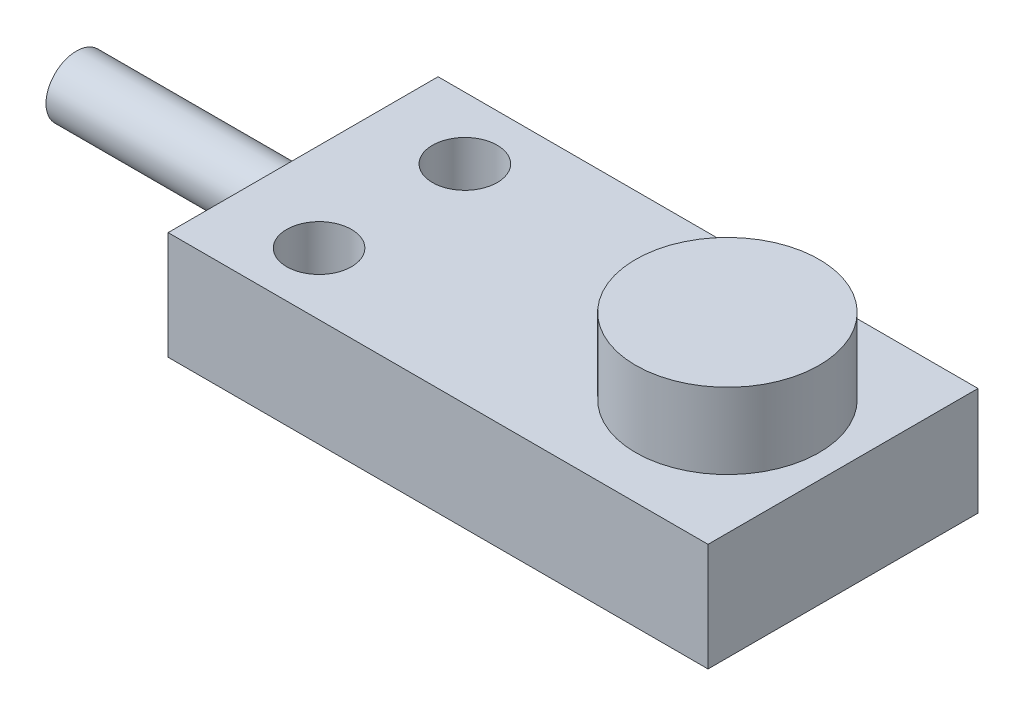
ISO-10303-21;
HEADER;
FILE_DESCRIPTION(('STEP AP214'),'2;1');
FILE_NAME('part.step','',(''),(''),'','','');
FILE_SCHEMA(('AUTOMOTIVE_DESIGN { 1 0 10303 214 1 1 1 1 }'));
ENDSEC;
DATA;
#1=APPLICATION_CONTEXT('core data for automotive mechanical design processes');
#2=APPLICATION_PROTOCOL_DEFINITION('international standard','automotive_design',2000,#1);
#3=PRODUCT_CONTEXT('',#1,'mechanical');
#4=PRODUCT('Part','Part','',(#3));
#5=PRODUCT_RELATED_PRODUCT_CATEGORY('part','',(#4));
#6=PRODUCT_DEFINITION_FORMATION('','',#4);
#7=PRODUCT_DEFINITION_CONTEXT('part definition',#1,'design');
#8=PRODUCT_DEFINITION('design','',#6,#7);
#9=PRODUCT_DEFINITION_SHAPE('','',#8);
#10=(LENGTH_UNIT() NAMED_UNIT(*) SI_UNIT(.MILLI.,.METRE.));
#11=(NAMED_UNIT(*) PLANE_ANGLE_UNIT() SI_UNIT($,.RADIAN.));
#12=(NAMED_UNIT(*) SI_UNIT($,.STERADIAN.) SOLID_ANGLE_UNIT());
#13=UNCERTAINTY_MEASURE_WITH_UNIT(LENGTH_MEASURE(1.E-05),#10,'distance_accuracy_value','');
#14=(GEOMETRIC_REPRESENTATION_CONTEXT(3) GLOBAL_UNCERTAINTY_ASSIGNED_CONTEXT((#13)) GLOBAL_UNIT_ASSIGNED_CONTEXT((#10,
#11,#12)) REPRESENTATION_CONTEXT('',''));
#15=CARTESIAN_POINT('',(0.,0.,0.));
#16=DIRECTION('',(0.,0.,1.));
#17=DIRECTION('',(1.,0.,0.));
#18=AXIS2_PLACEMENT_3D('',#15,#16,#17);
#19=CARTESIAN_POINT('',(25.,10.,0.));
#20=DIRECTION('',(1.,0.,0.));
#21=DIRECTION('',(0.,0.,-1.));
#22=AXIS2_PLACEMENT_3D('',#19,#20,#21);
#23=PLANE('',#22);
#24=DIRECTION('',(0.,0.,1.));
#25=VECTOR('',#24,1.);
#26=CARTESIAN_POINT('',(25.,0.,0.));
#27=LINE('',#26,#25);
#28=CARTESIAN_POINT('',(25.,0.,-12.5));
#29=VERTEX_POINT('',#28);
#30=CARTESIAN_POINT('',(25.,0.,12.5));
#31=VERTEX_POINT('',#30);
#32=EDGE_CURVE('E113',#29,#31,#27,.T.);
#33=ORIENTED_EDGE('',*,*,#32,.F.);
#34=DIRECTION('',(0.,-1.,0.));
#35=VECTOR('',#34,1.);
#36=CARTESIAN_POINT('',(25.,10.,-12.5));
#37=LINE('',#36,#35);
#38=CARTESIAN_POINT('',(25.,10.,-12.5));
#39=VERTEX_POINT('',#38);
#40=EDGE_CURVE('E43',#39,#29,#37,.T.);
#41=ORIENTED_EDGE('',*,*,#40,.F.);
#42=DIRECTION('',(0.,0.,1.));
#43=VECTOR('',#42,1.);
#44=CARTESIAN_POINT('',(25.,10.,0.));
#45=LINE('',#44,#43);
#46=CARTESIAN_POINT('',(25.,10.,12.5));
#47=VERTEX_POINT('',#46);
#48=EDGE_CURVE('E101',#39,#47,#45,.T.);
#49=ORIENTED_EDGE('',*,*,#48,.T.);
#50=DIRECTION('',(0.,-1.,0.));
#51=VECTOR('',#50,1.);
#52=CARTESIAN_POINT('',(25.,10.,12.5));
#53=LINE('',#52,#51);
#54=EDGE_CURVE('E80',#47,#31,#53,.T.);
#55=ORIENTED_EDGE('',*,*,#54,.T.);
#56=EDGE_LOOP('',(#33,#41,#49,#55));
#57=FACE_BOUND('',#56,.T.);
#58=ADVANCED_FACE('F40',(#57),#23,.T.);
#59=CARTESIAN_POINT('',(0.,10.,-12.5));
#60=DIRECTION('',(0.,0.,-1.));
#61=DIRECTION('',(-1.,0.,0.));
#62=AXIS2_PLACEMENT_3D('',#59,#60,#61);
#63=PLANE('',#62);
#64=DIRECTION('',(1.,0.,0.));
#65=VECTOR('',#64,1.);
#66=CARTESIAN_POINT('',(0.,0.,-12.5));
#67=LINE('',#66,#65);
#68=CARTESIAN_POINT('',(-25.,0.,-12.5));
#69=VERTEX_POINT('',#68);
#70=EDGE_CURVE('E94',#69,#29,#67,.T.);
#71=ORIENTED_EDGE('',*,*,#70,.F.);
#72=DIRECTION('',(0.,-1.,0.));
#73=VECTOR('',#72,1.);
#74=CARTESIAN_POINT('',(-25.,10.,-12.5));
#75=LINE('',#74,#73);
#76=CARTESIAN_POINT('',(-25.,10.,-12.5));
#77=VERTEX_POINT('',#76);
#78=EDGE_CURVE('E88',#77,#69,#75,.T.);
#79=ORIENTED_EDGE('',*,*,#78,.F.);
#80=DIRECTION('',(1.,0.,0.));
#81=VECTOR('',#80,1.);
#82=CARTESIAN_POINT('',(0.,10.,-12.5));
#83=LINE('',#82,#81);
#84=EDGE_CURVE('E92',#77,#39,#83,.T.);
#85=ORIENTED_EDGE('',*,*,#84,.T.);
#86=ORIENTED_EDGE('',*,*,#40,.T.);
#87=EDGE_LOOP('',(#71,#79,#85,#86));
#88=FACE_BOUND('',#87,.T.);
#89=ADVANCED_FACE('F90',(#88),#63,.T.);
#90=CARTESIAN_POINT('',(-25.,10.,0.));
#91=DIRECTION('',(1.,0.,0.));
#92=DIRECTION('',(0.,0.,-1.));
#93=AXIS2_PLACEMENT_3D('',#90,#91,#92);
#94=PLANE('',#93);
#95=CARTESIAN_POINT('',(-25.,5.,0.));
#96=DIRECTION('',(-1.,0.,0.));
#97=DIRECTION('',(0.,0.,1.));
#98=AXIS2_PLACEMENT_3D('',#95,#96,#97);
#99=CIRCLE('',#98,2.80875684078272);
#100=CARTESIAN_POINT('',(-25.,5.,2.80875684078272));
#101=VERTEX_POINT('',#100);
#102=EDGE_CURVE('E11',#101,#101,#99,.T.);
#103=ORIENTED_EDGE('',*,*,#102,.F.);
#104=EDGE_LOOP('',(#103));
#105=FACE_BOUND('',#104,.T.);
#106=DIRECTION('',(0.,0.,1.));
#107=VECTOR('',#106,1.);
#108=CARTESIAN_POINT('',(-25.,0.,0.));
#109=LINE('',#108,#107);
#110=CARTESIAN_POINT('',(-25.,0.,12.5));
#111=VERTEX_POINT('',#110);
#112=EDGE_CURVE('E73',#69,#111,#109,.T.);
#113=ORIENTED_EDGE('',*,*,#112,.T.);
#114=DIRECTION('',(0.,-1.,0.));
#115=VECTOR('',#114,1.);
#116=CARTESIAN_POINT('',(-25.,10.,12.5));
#117=LINE('',#116,#115);
#118=CARTESIAN_POINT('',(-25.,10.,12.5));
#119=VERTEX_POINT('',#118);
#120=EDGE_CURVE('E95',#119,#111,#117,.T.);
#121=ORIENTED_EDGE('',*,*,#120,.F.);
#122=DIRECTION('',(0.,0.,1.));
#123=VECTOR('',#122,1.);
#124=CARTESIAN_POINT('',(-25.,10.,0.));
#125=LINE('',#124,#123);
#126=EDGE_CURVE('E96',#77,#119,#125,.T.);
#127=ORIENTED_EDGE('',*,*,#126,.F.);
#128=ORIENTED_EDGE('',*,*,#78,.T.);
#129=EDGE_LOOP('',(#113,#121,#127,#128));
#130=FACE_BOUND('',#129,.T.);
#131=ADVANCED_FACE('F97',(#105,#130),#94,.F.);
#132=CARTESIAN_POINT('',(-16.769801980198,10.,-6.75));
#133=DIRECTION('',(0.,-1.,0.));
#134=DIRECTION('',(0.,0.,-1.));
#135=AXIS2_PLACEMENT_3D('',#132,#133,#134);
#136=CYLINDRICAL_SURFACE('',#135,3.);
#137=CARTESIAN_POINT('',(-16.769801980198,10.,-6.75));
#138=DIRECTION('',(0.,1.,0.));
#139=DIRECTION('',(0.,0.,1.));
#140=AXIS2_PLACEMENT_3D('',#137,#138,#139);
#141=CIRCLE('',#140,3.);
#142=CARTESIAN_POINT('',(-16.769801980198,10.,-3.75));
#143=VERTEX_POINT('',#142);
#144=EDGE_CURVE('E107',#143,#143,#141,.T.);
#145=ORIENTED_EDGE('',*,*,#144,.T.);
#146=EDGE_LOOP('',(#145));
#147=FACE_BOUND('',#146,.T.);
#148=CARTESIAN_POINT('',(-16.769801980198,0.,-6.75));
#149=DIRECTION('',(0.,1.,0.));
#150=DIRECTION('',(0.,0.,1.));
#151=AXIS2_PLACEMENT_3D('',#148,#149,#150);
#152=CIRCLE('',#151,3.);
#153=CARTESIAN_POINT('',(-16.769801980198,0.,-3.75));
#154=VERTEX_POINT('',#153);
#155=EDGE_CURVE('E121',#154,#154,#152,.T.);
#156=ORIENTED_EDGE('',*,*,#155,.F.);
#157=EDGE_LOOP('',(#156));
#158=FACE_BOUND('',#157,.T.);
#159=ADVANCED_FACE('F141',(#147,#158),#136,.F.);
#160=CARTESIAN_POINT('',(0.,10.,12.5));
#161=DIRECTION('',(0.,0.,-1.));
#162=DIRECTION('',(-1.,0.,0.));
#163=AXIS2_PLACEMENT_3D('',#160,#161,#162);
#164=PLANE('',#163);
#165=DIRECTION('',(1.,0.,0.));
#166=VECTOR('',#165,1.);
#167=CARTESIAN_POINT('',(0.,0.,12.5));
#168=LINE('',#167,#166);
#169=EDGE_CURVE('E119',#111,#31,#168,.T.);
#170=ORIENTED_EDGE('',*,*,#169,.T.);
#171=ORIENTED_EDGE('',*,*,#54,.F.);
#172=DIRECTION('',(1.,0.,0.));
#173=VECTOR('',#172,1.);
#174=CARTESIAN_POINT('',(0.,10.,12.5));
#175=LINE('',#174,#173);
#176=EDGE_CURVE('E57',#119,#47,#175,.T.);
#177=ORIENTED_EDGE('',*,*,#176,.F.);
#178=ORIENTED_EDGE('',*,*,#120,.T.);
#179=EDGE_LOOP('',(#170,#171,#177,#178));
#180=FACE_BOUND('',#179,.T.);
#181=ADVANCED_FACE('F129',(#180),#164,.F.);
#182=CARTESIAN_POINT('',(-16.769801980198,10.,6.75));
#183=DIRECTION('',(0.,-1.,0.));
#184=DIRECTION('',(0.,0.,-1.));
#185=AXIS2_PLACEMENT_3D('',#182,#183,#184);
#186=CYLINDRICAL_SURFACE('',#185,3.);
#187=CARTESIAN_POINT('',(-16.769801980198,10.,6.75));
#188=DIRECTION('',(0.,1.,0.));
#189=DIRECTION('',(0.,0.,1.));
#190=AXIS2_PLACEMENT_3D('',#187,#188,#189);
#191=CIRCLE('',#190,3.);
#192=CARTESIAN_POINT('',(-16.769801980198,10.,9.75));
#193=VERTEX_POINT('',#192);
#194=EDGE_CURVE('E110',#193,#193,#191,.F.);
#195=ORIENTED_EDGE('',*,*,#194,.F.);
#196=EDGE_LOOP('',(#195));
#197=FACE_BOUND('',#196,.T.);
#198=CARTESIAN_POINT('',(-16.769801980198,0.,6.75));
#199=DIRECTION('',(0.,1.,0.));
#200=DIRECTION('',(0.,0.,1.));
#201=AXIS2_PLACEMENT_3D('',#198,#199,#200);
#202=CIRCLE('',#201,3.);
#203=CARTESIAN_POINT('',(-16.769801980198,0.,9.75));
#204=VERTEX_POINT('',#203);
#205=EDGE_CURVE('E103',#204,#204,#202,.F.);
#206=ORIENTED_EDGE('',*,*,#205,.T.);
#207=EDGE_LOOP('',(#206));
#208=FACE_BOUND('',#207,.T.);
#209=ADVANCED_FACE('F147',(#197,#208),#186,.F.);
#210=CARTESIAN_POINT('',(0.,10.,0.));
#211=DIRECTION('',(0.,1.,0.));
#212=DIRECTION('',(0.,0.,1.));
#213=AXIS2_PLACEMENT_3D('',#210,#211,#212);
#214=PLANE('',#213);
#215=CARTESIAN_POINT('',(14.2945544554323,10.,0.));
#216=DIRECTION('',(0.,1.,0.));
#217=DIRECTION('',(0.,0.,1.));
#218=AXIS2_PLACEMENT_3D('',#215,#216,#217);
#219=CIRCLE('',#218,8.5);
#220=CARTESIAN_POINT('',(14.2945544554323,10.,8.50000000000001));
#221=VERTEX_POINT('',#220);
#222=EDGE_CURVE('E179',#221,#221,#219,.F.);
#223=ORIENTED_EDGE('',*,*,#222,.T.);
#224=EDGE_LOOP('',(#223));
#225=FACE_BOUND('',#224,.T.);
#226=ORIENTED_EDGE('',*,*,#48,.F.);
#227=ORIENTED_EDGE('',*,*,#84,.F.);
#228=ORIENTED_EDGE('',*,*,#126,.T.);
#229=ORIENTED_EDGE('',*,*,#176,.T.);
#230=EDGE_LOOP('',(#226,#227,#228,#229));
#231=FACE_BOUND('',#230,.T.);
#232=ORIENTED_EDGE('',*,*,#144,.F.);
#233=EDGE_LOOP('',(#232));
#234=FACE_BOUND('',#233,.T.);
#235=ORIENTED_EDGE('',*,*,#194,.T.);
#236=EDGE_LOOP('',(#235));
#237=FACE_BOUND('',#236,.T.);
#238=ADVANCED_FACE('F99',(#225,#231,#234,#237),#214,.T.);
#239=CARTESIAN_POINT('',(0.,0.,0.));
#240=DIRECTION('',(0.,1.,0.));
#241=DIRECTION('',(0.,0.,1.));
#242=AXIS2_PLACEMENT_3D('',#239,#240,#241);
#243=PLANE('',#242);
#244=ORIENTED_EDGE('',*,*,#32,.T.);
#245=ORIENTED_EDGE('',*,*,#169,.F.);
#246=ORIENTED_EDGE('',*,*,#112,.F.);
#247=ORIENTED_EDGE('',*,*,#70,.T.);
#248=EDGE_LOOP('',(#244,#245,#246,#247));
#249=FACE_BOUND('',#248,.T.);
#250=ORIENTED_EDGE('',*,*,#155,.T.);
#251=EDGE_LOOP('',(#250));
#252=FACE_BOUND('',#251,.T.);
#253=ORIENTED_EDGE('',*,*,#205,.F.);
#254=EDGE_LOOP('',(#253));
#255=FACE_BOUND('',#254,.T.);
#256=ADVANCED_FACE('F131',(#249,#252,#255),#243,.F.);
#257=CARTESIAN_POINT('',(-46.,5.,0.));
#258=DIRECTION('',(1.,0.,0.));
#259=DIRECTION('',(0.,0.,-1.));
#260=AXIS2_PLACEMENT_3D('',#257,#258,#259);
#261=CYLINDRICAL_SURFACE('',#260,2.80875684078272);
#262=CARTESIAN_POINT('',(-46.,5.,0.));
#263=DIRECTION('',(-1.,0.,0.));
#264=DIRECTION('',(0.,0.,1.));
#265=AXIS2_PLACEMENT_3D('',#262,#263,#264);
#266=CIRCLE('',#265,2.80875684078272);
#267=CARTESIAN_POINT('',(-46.,5.,2.80875684078273));
#268=VERTEX_POINT('',#267);
#269=EDGE_CURVE('E116',#268,#268,#266,.T.);
#270=ORIENTED_EDGE('',*,*,#269,.F.);
#271=EDGE_LOOP('',(#270));
#272=FACE_BOUND('',#271,.T.);
#273=ORIENTED_EDGE('',*,*,#102,.T.);
#274=EDGE_LOOP('',(#273));
#275=FACE_BOUND('',#274,.T.);
#276=ADVANCED_FACE('F155',(#272,#275),#261,.T.);
#277=CARTESIAN_POINT('',(-46.,5.,0.));
#278=DIRECTION('',(-1.,0.,0.));
#279=DIRECTION('',(0.,0.,1.));
#280=AXIS2_PLACEMENT_3D('',#277,#278,#279);
#281=PLANE('',#280);
#282=ORIENTED_EDGE('',*,*,#269,.T.);
#283=EDGE_LOOP('',(#282));
#284=FACE_BOUND('',#283,.T.);
#285=ADVANCED_FACE('F161',(#284),#281,.T.);
#286=CARTESIAN_POINT('',(14.2945544554323,17.,0.));
#287=DIRECTION('',(0.,-1.,0.));
#288=DIRECTION('',(0.,0.,-1.));
#289=AXIS2_PLACEMENT_3D('',#286,#287,#288);
#290=CYLINDRICAL_SURFACE('',#289,8.5);
#291=ORIENTED_EDGE('',*,*,#222,.F.);
#292=EDGE_LOOP('',(#291));
#293=FACE_BOUND('',#292,.T.);
#294=CARTESIAN_POINT('',(14.2945544554323,17.,0.));
#295=DIRECTION('',(0.,1.,0.));
#296=DIRECTION('',(0.,0.,1.));
#297=AXIS2_PLACEMENT_3D('',#294,#295,#296);
#298=CIRCLE('',#297,8.5);
#299=CARTESIAN_POINT('',(14.2945544554323,17.,8.50000000000001));
#300=VERTEX_POINT('',#299);
#301=EDGE_CURVE('E177',#300,#300,#298,.T.);
#302=ORIENTED_EDGE('',*,*,#301,.F.);
#303=EDGE_LOOP('',(#302));
#304=FACE_BOUND('',#303,.T.);
#305=ADVANCED_FACE('F165',(#293,#304),#290,.T.);
#306=CARTESIAN_POINT('',(0.,17.,0.));
#307=DIRECTION('',(0.,1.,0.));
#308=DIRECTION('',(0.,0.,1.));
#309=AXIS2_PLACEMENT_3D('',#306,#307,#308);
#310=PLANE('',#309);
#311=ORIENTED_EDGE('',*,*,#301,.T.);
#312=EDGE_LOOP('',(#311));
#313=FACE_BOUND('',#312,.T.);
#314=ADVANCED_FACE('F169',(#313),#310,.T.);
#315=CLOSED_SHELL('',(#58,#89,#131,#159,#181,#209,#238,#256,#276,#285,#305,#314));
#316=MANIFOLD_SOLID_BREP('B2',#315);
#317=ADVANCED_BREP_SHAPE_REPRESENTATION('',(#18,#316),#14);
#318=SHAPE_DEFINITION_REPRESENTATION(#9,#317);
ENDSEC;
END-ISO-10303-21;
